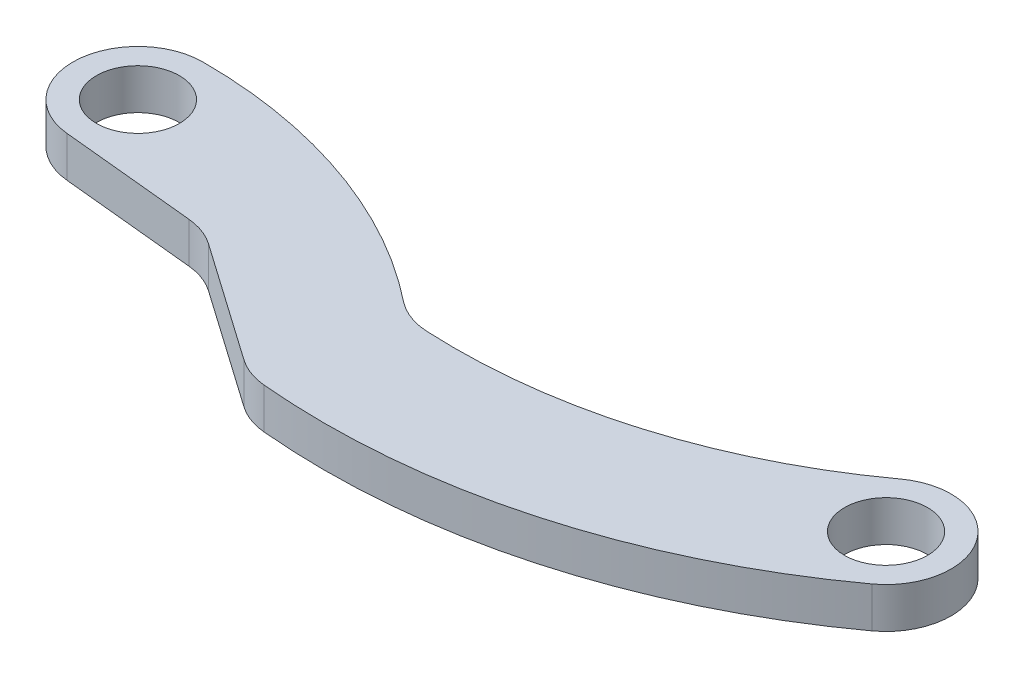
ISO-10303-21;
HEADER;
FILE_DESCRIPTION(('STEP AP214'),'2;1');
FILE_NAME('part.step','',(''),(''),'','','');
FILE_SCHEMA(('AUTOMOTIVE_DESIGN { 1 0 10303 214 1 1 1 1 }'));
ENDSEC;
DATA;
#1=APPLICATION_CONTEXT('core data for automotive mechanical design processes');
#2=APPLICATION_PROTOCOL_DEFINITION('international standard','automotive_design',2000,#1);
#3=PRODUCT_CONTEXT('',#1,'mechanical');
#4=PRODUCT('Part','Part','',(#3));
#5=PRODUCT_RELATED_PRODUCT_CATEGORY('part','',(#4));
#6=PRODUCT_DEFINITION_FORMATION('','',#4);
#7=PRODUCT_DEFINITION_CONTEXT('part definition',#1,'design');
#8=PRODUCT_DEFINITION('design','',#6,#7);
#9=PRODUCT_DEFINITION_SHAPE('','',#8);
#10=(LENGTH_UNIT() NAMED_UNIT(*) SI_UNIT(.MILLI.,.METRE.));
#11=(NAMED_UNIT(*) PLANE_ANGLE_UNIT() SI_UNIT($,.RADIAN.));
#12=(NAMED_UNIT(*) SI_UNIT($,.STERADIAN.) SOLID_ANGLE_UNIT());
#13=UNCERTAINTY_MEASURE_WITH_UNIT(LENGTH_MEASURE(1.E-05),#10,'distance_accuracy_value','');
#14=(GEOMETRIC_REPRESENTATION_CONTEXT(3) GLOBAL_UNCERTAINTY_ASSIGNED_CONTEXT((#13)) GLOBAL_UNIT_ASSIGNED_CONTEXT((#10,
#11,#12)) REPRESENTATION_CONTEXT('',''));
#15=CARTESIAN_POINT('',(0.,0.,0.));
#16=DIRECTION('',(0.,0.,1.));
#17=DIRECTION('',(1.,0.,0.));
#18=AXIS2_PLACEMENT_3D('',#15,#16,#17);
#19=CARTESIAN_POINT('',(0.,5.,0.));
#20=DIRECTION('',(0.,1.,0.));
#21=DIRECTION('',(0.,0.,1.));
#22=AXIS2_PLACEMENT_3D('',#19,#20,#21);
#23=PLANE('',#22);
#24=CARTESIAN_POINT('',(0.,5.,0.));
#25=DIRECTION('',(0.,1.,0.));
#26=DIRECTION('',(0.,0.,1.));
#27=AXIS2_PLACEMENT_3D('',#24,#25,#26);
#28=CIRCLE('',#27,5.1);
#29=CARTESIAN_POINT('',(0.,5.,5.1));
#30=VERTEX_POINT('',#29);
#31=EDGE_CURVE('E212',#30,#30,#28,.T.);
#32=ORIENTED_EDGE('',*,*,#31,.F.);
#33=EDGE_LOOP('',(#32));
#34=FACE_BOUND('',#33,.T.);
#35=DIRECTION('',(0.819152044289021,0.,0.573576436351005));
#36=VECTOR('',#35,1.);
#37=CARTESIAN_POINT('',(17.9822733395991,5.,9.81869503447825));
#38=LINE('',#37,#36);
#39=CARTESIAN_POINT('',(19.6983074450643,5.,11.0202750509498));
#40=VERTEX_POINT('',#39);
#41=CARTESIAN_POINT('',(34.2865390892747,5.,21.2350648173743));
#42=VERTEX_POINT('',#41);
#43=EDGE_CURVE('E126',#40,#42,#38,.T.);
#44=ORIENTED_EDGE('',*,*,#43,.T.);
#45=CARTESIAN_POINT('',(38.8751505800827,5.,14.6818484630621));
#46=DIRECTION('',(0.,1.,0.));
#47=DIRECTION('',(0.,0.,1.));
#48=AXIS2_PLACEMENT_3D('',#45,#46,#47);
#49=CIRCLE('',#48,8.);
#50=CARTESIAN_POINT('',(38.1443967934245,5.,22.6484034841038));
#51=VERTEX_POINT('',#50);
#52=EDGE_CURVE('E171',#42,#51,#49,.T.);
#53=ORIENTED_EDGE('',*,*,#52,.T.);
#54=CARTESIAN_POINT('',(46.,5.,-62.9920629920945));
#55=DIRECTION('',(0.,1.,0.));
#56=DIRECTION('',(0.,0.,-1.));
#57=AXIS2_PLACEMENT_3D('',#54,#55,#56);
#58=CIRCLE('',#57,86.);
#59=CARTESIAN_POINT('',(96.7179487179487,5.,6.46072440944556));
#60=VERTEX_POINT('',#59);
#61=EDGE_CURVE('E196',#51,#60,#58,.T.);
#62=ORIENTED_EDGE('',*,*,#61,.T.);
#63=CARTESIAN_POINT('',(92.,5.,0.));
#64=DIRECTION('',(0.,1.,0.));
#65=DIRECTION('',(0.,0.,1.));
#66=AXIS2_PLACEMENT_3D('',#63,#64,#65);
#67=CIRCLE('',#66,8.00000000000001);
#68=CARTESIAN_POINT('',(87.2820512820513,5.,-6.46072440944559));
#69=VERTEX_POINT('',#68);
#70=EDGE_CURVE('E199',#60,#69,#67,.T.);
#71=ORIENTED_EDGE('',*,*,#70,.T.);
#72=CARTESIAN_POINT('',(46.,5.,-62.9920629920945));
#73=DIRECTION('',(0.,-1.,0.));
#74=DIRECTION('',(0.,0.,1.));
#75=AXIS2_PLACEMENT_3D('',#72,#73,#74);
#76=CIRCLE('',#75,70.);
#77=CARTESIAN_POINT('',(42.4262447468211,5.,6.91665086669692));
#78=VERTEX_POINT('',#77);
#79=EDGE_CURVE('E204',#69,#78,#76,.T.);
#80=ORIENTED_EDGE('',*,*,#79,.T.);
#81=CARTESIAN_POINT('',(42.8346739186129,5.,-1.07291643145068));
#82=DIRECTION('',(0.,1.,0.));
#83=DIRECTION('',(0.,0.,1.));
#84=AXIS2_PLACEMENT_3D('',#81,#82,#83);
#85=CIRCLE('',#84,8.);
#86=CARTESIAN_POINT('',(37.8627584301677,5.,5.19446391250153));
#87=VERTEX_POINT('',#86);
#88=EDGE_CURVE('E179',#78,#87,#85,.F.);
#89=ORIENTED_EDGE('',*,*,#88,.T.);
#90=CARTESIAN_POINT('',(0.,5.,52.9226098362471));
#91=DIRECTION('',(0.,1.,0.));
#92=DIRECTION('',(0.,0.,-1.));
#93=AXIS2_PLACEMENT_3D('',#90,#91,#92);
#94=CIRCLE('',#93,60.9226098362471);
#95=CARTESIAN_POINT('',(0.,5.,-7.99999999999999));
#96=VERTEX_POINT('',#95);
#97=EDGE_CURVE('E132',#87,#96,#94,.T.);
#98=ORIENTED_EDGE('',*,*,#97,.T.);
#99=CARTESIAN_POINT('',(0.,5.,0.));
#100=DIRECTION('',(0.,1.,0.));
#101=DIRECTION('',(0.,0.,1.));
#102=AXIS2_PLACEMENT_3D('',#99,#100,#101);
#103=CIRCLE('',#102,8.);
#104=CARTESIAN_POINT('',(-0.787870548468119,5.,7.96110921912624));
#105=VERTEX_POINT('',#104);
#106=EDGE_CURVE('E127',#96,#105,#103,.T.);
#107=ORIENTED_EDGE('',*,*,#106,.T.);
#108=DIRECTION('',(0.995138652390778,0.,0.0984838185585147));
#109=VECTOR('',#108,1.);
#110=CARTESIAN_POINT('',(-0.787870548468119,5.,7.96110921912624));
#111=LINE('',#110,#109);
#112=CARTESIAN_POINT('',(15.8975665027244,5.,9.61238218613574));
#113=VERTEX_POINT('',#112);
#114=EDGE_CURVE('E117',#105,#113,#111,.T.);
#115=ORIENTED_EDGE('',*,*,#114,.T.);
#116=CARTESIAN_POINT('',(15.1096959542563,5.,17.573491405262));
#117=DIRECTION('',(0.,1.,0.));
#118=DIRECTION('',(0.,0.,1.));
#119=AXIS2_PLACEMENT_3D('',#116,#117,#118);
#120=CIRCLE('',#119,8.);
#121=EDGE_CURVE('E11',#113,#40,#120,.F.);
#122=ORIENTED_EDGE('',*,*,#121,.T.);
#123=EDGE_LOOP('',(#44,#53,#62,#71,#80,#89,#98,#107,#115,#122));
#124=FACE_BOUND('',#123,.T.);
#125=CARTESIAN_POINT('',(92.,5.,0.));
#126=DIRECTION('',(0.,1.,0.));
#127=DIRECTION('',(0.,0.,1.));
#128=AXIS2_PLACEMENT_3D('',#125,#126,#127);
#129=CIRCLE('',#128,5.1);
#130=CARTESIAN_POINT('',(92.,5.,5.1));
#131=VERTEX_POINT('',#130);
#132=EDGE_CURVE('E278',#131,#131,#129,.T.);
#133=ORIENTED_EDGE('',*,*,#132,.F.);
#134=EDGE_LOOP('',(#133));
#135=FACE_BOUND('',#134,.T.);
#136=ADVANCED_FACE('F39',(#34,#124,#135),#23,.T.);
#137=CARTESIAN_POINT('',(0.,0.,0.));
#138=DIRECTION('',(0.,1.,0.));
#139=DIRECTION('',(0.,0.,1.));
#140=AXIS2_PLACEMENT_3D('',#137,#138,#139);
#141=PLANE('',#140);
#142=CARTESIAN_POINT('',(46.,0.,-62.9920629920945));
#143=DIRECTION('',(0.,1.,0.));
#144=DIRECTION('',(0.,0.,-1.));
#145=AXIS2_PLACEMENT_3D('',#142,#143,#144);
#146=CIRCLE('',#145,86.);
#147=CARTESIAN_POINT('',(38.1443967934245,0.,22.6484034841038));
#148=VERTEX_POINT('',#147);
#149=CARTESIAN_POINT('',(96.7179487179487,0.,6.46072440944556));
#150=VERTEX_POINT('',#149);
#151=EDGE_CURVE('E216',#148,#150,#146,.T.);
#152=ORIENTED_EDGE('',*,*,#151,.F.);
#153=CARTESIAN_POINT('',(38.8751505800827,0.,14.6818484630621));
#154=DIRECTION('',(0.,1.,0.));
#155=DIRECTION('',(0.,0.,1.));
#156=AXIS2_PLACEMENT_3D('',#153,#154,#155);
#157=CIRCLE('',#156,8.);
#158=CARTESIAN_POINT('',(34.2865390892747,0.,21.2350648173743));
#159=VERTEX_POINT('',#158);
#160=EDGE_CURVE('E162',#148,#159,#157,.F.);
#161=ORIENTED_EDGE('',*,*,#160,.T.);
#162=DIRECTION('',(0.819152044289021,0.,0.573576436351005));
#163=VECTOR('',#162,1.);
#164=CARTESIAN_POINT('',(17.9822733395991,0.,9.81869503447825));
#165=LINE('',#164,#163);
#166=CARTESIAN_POINT('',(19.6983074450643,0.,11.0202750509498));
#167=VERTEX_POINT('',#166);
#168=EDGE_CURVE('E188',#167,#159,#165,.T.);
#169=ORIENTED_EDGE('',*,*,#168,.F.);
#170=CARTESIAN_POINT('',(15.1096959542563,0.,17.573491405262));
#171=DIRECTION('',(0.,1.,0.));
#172=DIRECTION('',(0.,0.,1.));
#173=AXIS2_PLACEMENT_3D('',#170,#171,#172);
#174=CIRCLE('',#173,8.);
#175=CARTESIAN_POINT('',(15.8975665027244,0.,9.61238218613574));
#176=VERTEX_POINT('',#175);
#177=EDGE_CURVE('E48',#167,#176,#174,.T.);
#178=ORIENTED_EDGE('',*,*,#177,.T.);
#179=DIRECTION('',(0.995138652390778,0.,0.0984838185585147));
#180=VECTOR('',#179,1.);
#181=CARTESIAN_POINT('',(-0.787870548468119,0.,7.96110921912624));
#182=LINE('',#181,#180);
#183=CARTESIAN_POINT('',(-0.787870548468119,0.,7.96110921912624));
#184=VERTEX_POINT('',#183);
#185=EDGE_CURVE('E187',#184,#176,#182,.T.);
#186=ORIENTED_EDGE('',*,*,#185,.F.);
#187=CARTESIAN_POINT('',(0.,0.,0.));
#188=DIRECTION('',(0.,1.,0.));
#189=DIRECTION('',(0.,0.,1.));
#190=AXIS2_PLACEMENT_3D('',#187,#188,#189);
#191=CIRCLE('',#190,8.);
#192=CARTESIAN_POINT('',(0.,0.,-7.99999999999999));
#193=VERTEX_POINT('',#192);
#194=EDGE_CURVE('E141',#193,#184,#191,.T.);
#195=ORIENTED_EDGE('',*,*,#194,.F.);
#196=CARTESIAN_POINT('',(0.,0.,52.9226098362471));
#197=DIRECTION('',(0.,1.,0.));
#198=DIRECTION('',(0.,0.,-1.));
#199=AXIS2_PLACEMENT_3D('',#196,#197,#198);
#200=CIRCLE('',#199,60.9226098362471);
#201=CARTESIAN_POINT('',(37.8627584301677,0.,5.19446391250153));
#202=VERTEX_POINT('',#201);
#203=EDGE_CURVE('E137',#202,#193,#200,.T.);
#204=ORIENTED_EDGE('',*,*,#203,.F.);
#205=CARTESIAN_POINT('',(42.8346739186129,0.,-1.07291643145068));
#206=DIRECTION('',(0.,1.,0.));
#207=DIRECTION('',(0.,0.,1.));
#208=AXIS2_PLACEMENT_3D('',#205,#206,#207);
#209=CIRCLE('',#208,8.);
#210=CARTESIAN_POINT('',(42.4262447468211,0.,6.91665086669692));
#211=VERTEX_POINT('',#210);
#212=EDGE_CURVE('E176',#202,#211,#209,.T.);
#213=ORIENTED_EDGE('',*,*,#212,.T.);
#214=CARTESIAN_POINT('',(46.,0.,-62.9920629920945));
#215=DIRECTION('',(0.,-1.,0.));
#216=DIRECTION('',(0.,0.,1.));
#217=AXIS2_PLACEMENT_3D('',#214,#215,#216);
#218=CIRCLE('',#217,70.);
#219=CARTESIAN_POINT('',(87.2820512820513,0.,-6.46072440944559));
#220=VERTEX_POINT('',#219);
#221=EDGE_CURVE('E222',#220,#211,#218,.T.);
#222=ORIENTED_EDGE('',*,*,#221,.F.);
#223=CARTESIAN_POINT('',(92.,0.,0.));
#224=DIRECTION('',(0.,1.,0.));
#225=DIRECTION('',(0.,0.,1.));
#226=AXIS2_PLACEMENT_3D('',#223,#224,#225);
#227=CIRCLE('',#226,8.00000000000001);
#228=EDGE_CURVE('E219',#150,#220,#227,.T.);
#229=ORIENTED_EDGE('',*,*,#228,.F.);
#230=EDGE_LOOP('',(#152,#161,#169,#178,#186,#195,#204,#213,#222,#229));
#231=FACE_BOUND('',#230,.T.);
#232=CARTESIAN_POINT('',(0.,0.,0.));
#233=DIRECTION('',(0.,1.,0.));
#234=DIRECTION('',(0.,0.,1.));
#235=AXIS2_PLACEMENT_3D('',#232,#233,#234);
#236=CIRCLE('',#235,5.1);
#237=CARTESIAN_POINT('',(0.,0.,5.1));
#238=VERTEX_POINT('',#237);
#239=EDGE_CURVE('E286',#238,#238,#236,.T.);
#240=ORIENTED_EDGE('',*,*,#239,.T.);
#241=EDGE_LOOP('',(#240));
#242=FACE_BOUND('',#241,.T.);
#243=CARTESIAN_POINT('',(92.,0.,0.));
#244=DIRECTION('',(0.,1.,0.));
#245=DIRECTION('',(0.,0.,1.));
#246=AXIS2_PLACEMENT_3D('',#243,#244,#245);
#247=CIRCLE('',#246,5.1);
#248=CARTESIAN_POINT('',(92.,0.,5.1));
#249=VERTEX_POINT('',#248);
#250=EDGE_CURVE('E281',#249,#249,#247,.T.);
#251=ORIENTED_EDGE('',*,*,#250,.T.);
#252=EDGE_LOOP('',(#251));
#253=FACE_BOUND('',#252,.T.);
#254=ADVANCED_FACE('F185',(#231,#242,#253),#141,.F.);
#255=CARTESIAN_POINT('',(0.,5.,0.));
#256=DIRECTION('',(0.,-1.,0.));
#257=DIRECTION('',(0.,0.,-1.));
#258=AXIS2_PLACEMENT_3D('',#255,#256,#257);
#259=CYLINDRICAL_SURFACE('',#258,8.);
#260=ORIENTED_EDGE('',*,*,#194,.T.);
#261=DIRECTION('',(0.,-1.,0.));
#262=VECTOR('',#261,1.);
#263=CARTESIAN_POINT('',(-0.787870548468119,5.,7.96110921912624));
#264=LINE('',#263,#262);
#265=EDGE_CURVE('E121',#105,#184,#264,.T.);
#266=ORIENTED_EDGE('',*,*,#265,.F.);
#267=ORIENTED_EDGE('',*,*,#106,.F.);
#268=DIRECTION('',(0.,-1.,0.));
#269=VECTOR('',#268,1.);
#270=CARTESIAN_POINT('',(0.,5.,-7.99999999999999));
#271=LINE('',#270,#269);
#272=EDGE_CURVE('E210',#96,#193,#271,.T.);
#273=ORIENTED_EDGE('',*,*,#272,.T.);
#274=EDGE_LOOP('',(#260,#266,#267,#273));
#275=FACE_BOUND('',#274,.T.);
#276=ADVANCED_FACE('F139',(#275),#259,.T.);
#277=CARTESIAN_POINT('',(-0.787870548468119,5.,7.96110921912624));
#278=DIRECTION('',(0.0984838185585147,0.,-0.995138652390778));
#279=DIRECTION('',(-0.995138652390778,0.,-0.0984838185585147));
#280=AXIS2_PLACEMENT_3D('',#277,#278,#279);
#281=PLANE('',#280);
#282=ORIENTED_EDGE('',*,*,#185,.T.);
#283=DIRECTION('',(0.,-1.,0.));
#284=VECTOR('',#283,1.);
#285=CARTESIAN_POINT('',(15.8975665027244,5.,9.61238218613574));
#286=LINE('',#285,#284);
#287=EDGE_CURVE('E55',#176,#113,#286,.F.);
#288=ORIENTED_EDGE('',*,*,#287,.T.);
#289=ORIENTED_EDGE('',*,*,#114,.F.);
#290=ORIENTED_EDGE('',*,*,#265,.T.);
#291=EDGE_LOOP('',(#282,#288,#289,#290));
#292=FACE_BOUND('',#291,.T.);
#293=ADVANCED_FACE('F119',(#292),#281,.F.);
#294=CARTESIAN_POINT('',(17.9822733395991,5.,9.81869503447825));
#295=DIRECTION('',(0.573576436351005,0.,-0.819152044289021));
#296=DIRECTION('',(-0.819152044289021,0.,-0.573576436351005));
#297=AXIS2_PLACEMENT_3D('',#294,#295,#296);
#298=PLANE('',#297);
#299=ORIENTED_EDGE('',*,*,#168,.T.);
#300=DIRECTION('',(0.,-1.,0.));
#301=VECTOR('',#300,1.);
#302=CARTESIAN_POINT('',(34.2865390892747,5.,21.2350648173743));
#303=LINE('',#302,#301);
#304=EDGE_CURVE('E63',#159,#42,#303,.F.);
#305=ORIENTED_EDGE('',*,*,#304,.T.);
#306=ORIENTED_EDGE('',*,*,#43,.F.);
#307=DIRECTION('',(0.,-1.,0.));
#308=VECTOR('',#307,1.);
#309=CARTESIAN_POINT('',(19.6983074450643,0.,11.0202750509498));
#310=LINE('',#309,#308);
#311=EDGE_CURVE('E165',#40,#167,#310,.T.);
#312=ORIENTED_EDGE('',*,*,#311,.T.);
#313=EDGE_LOOP('',(#299,#305,#306,#312));
#314=FACE_BOUND('',#313,.T.);
#315=ADVANCED_FACE('F194',(#314),#298,.F.);
#316=CARTESIAN_POINT('',(46.,5.,-62.9920629920945));
#317=DIRECTION('',(0.,-1.,0.));
#318=DIRECTION('',(0.,0.,-1.));
#319=AXIS2_PLACEMENT_3D('',#316,#317,#318);
#320=CYLINDRICAL_SURFACE('',#319,86.);
#321=ORIENTED_EDGE('',*,*,#61,.F.);
#322=DIRECTION('',(0.,-1.,0.));
#323=VECTOR('',#322,1.);
#324=CARTESIAN_POINT('',(38.1443967934245,5.,22.6484034841038));
#325=LINE('',#324,#323);
#326=EDGE_CURVE('E158',#51,#148,#325,.T.);
#327=ORIENTED_EDGE('',*,*,#326,.T.);
#328=ORIENTED_EDGE('',*,*,#151,.T.);
#329=DIRECTION('',(0.,-1.,0.));
#330=VECTOR('',#329,1.);
#331=CARTESIAN_POINT('',(96.7179487179487,5.,6.46072440944556));
#332=LINE('',#331,#330);
#333=EDGE_CURVE('E144',#60,#150,#332,.T.);
#334=ORIENTED_EDGE('',*,*,#333,.F.);
#335=EDGE_LOOP('',(#321,#327,#328,#334));
#336=FACE_BOUND('',#335,.T.);
#337=ADVANCED_FACE('F307',(#336),#320,.T.);
#338=CARTESIAN_POINT('',(92.,5.,0.));
#339=DIRECTION('',(0.,-1.,0.));
#340=DIRECTION('',(0.,0.,-1.));
#341=AXIS2_PLACEMENT_3D('',#338,#339,#340);
#342=CYLINDRICAL_SURFACE('',#341,8.00000000000001);
#343=ORIENTED_EDGE('',*,*,#228,.T.);
#344=DIRECTION('',(0.,-1.,0.));
#345=VECTOR('',#344,1.);
#346=CARTESIAN_POINT('',(87.2820512820513,5.,-6.46072440944559));
#347=LINE('',#346,#345);
#348=EDGE_CURVE('E152',#69,#220,#347,.T.);
#349=ORIENTED_EDGE('',*,*,#348,.F.);
#350=ORIENTED_EDGE('',*,*,#70,.F.);
#351=ORIENTED_EDGE('',*,*,#333,.T.);
#352=EDGE_LOOP('',(#343,#349,#350,#351));
#353=FACE_BOUND('',#352,.T.);
#354=ADVANCED_FACE('F257',(#353),#342,.T.);
#355=CARTESIAN_POINT('',(46.,5.,-62.9920629920945));
#356=DIRECTION('',(0.,-1.,0.));
#357=DIRECTION('',(0.,0.,-1.));
#358=AXIS2_PLACEMENT_3D('',#355,#356,#357);
#359=CYLINDRICAL_SURFACE('',#358,70.);
#360=ORIENTED_EDGE('',*,*,#221,.T.);
#361=DIRECTION('',(0.,-1.,0.));
#362=VECTOR('',#361,1.);
#363=CARTESIAN_POINT('',(42.4262447468211,5.,6.91665086669693));
#364=LINE('',#363,#362);
#365=EDGE_CURVE('E149',#211,#78,#364,.F.);
#366=ORIENTED_EDGE('',*,*,#365,.T.);
#367=ORIENTED_EDGE('',*,*,#79,.F.);
#368=ORIENTED_EDGE('',*,*,#348,.T.);
#369=EDGE_LOOP('',(#360,#366,#367,#368));
#370=FACE_BOUND('',#369,.T.);
#371=ADVANCED_FACE('F235',(#370),#359,.F.);
#372=CARTESIAN_POINT('',(0.,5.,52.9226098362471));
#373=DIRECTION('',(0.,-1.,0.));
#374=DIRECTION('',(0.,0.,-1.));
#375=AXIS2_PLACEMENT_3D('',#372,#373,#374);
#376=CYLINDRICAL_SURFACE('',#375,60.9226098362471);
#377=ORIENTED_EDGE('',*,*,#97,.F.);
#378=DIRECTION('',(0.,-1.,0.));
#379=VECTOR('',#378,1.);
#380=CARTESIAN_POINT('',(37.8627584301677,5.,5.19446391250152));
#381=LINE('',#380,#379);
#382=EDGE_CURVE('E143',#87,#202,#381,.T.);
#383=ORIENTED_EDGE('',*,*,#382,.T.);
#384=ORIENTED_EDGE('',*,*,#203,.T.);
#385=ORIENTED_EDGE('',*,*,#272,.F.);
#386=EDGE_LOOP('',(#377,#383,#384,#385));
#387=FACE_BOUND('',#386,.T.);
#388=ADVANCED_FACE('F246',(#387),#376,.T.);
#389=CARTESIAN_POINT('',(0.,5.,0.));
#390=DIRECTION('',(0.,-1.,0.));
#391=DIRECTION('',(0.,0.,-1.));
#392=AXIS2_PLACEMENT_3D('',#389,#390,#391);
#393=CYLINDRICAL_SURFACE('',#392,5.1);
#394=ORIENTED_EDGE('',*,*,#31,.T.);
#395=EDGE_LOOP('',(#394));
#396=FACE_BOUND('',#395,.T.);
#397=ORIENTED_EDGE('',*,*,#239,.F.);
#398=EDGE_LOOP('',(#397));
#399=FACE_BOUND('',#398,.T.);
#400=ADVANCED_FACE('F248',(#396,#399),#393,.F.);
#401=CARTESIAN_POINT('',(92.,5.,0.));
#402=DIRECTION('',(0.,-1.,0.));
#403=DIRECTION('',(0.,0.,-1.));
#404=AXIS2_PLACEMENT_3D('',#401,#402,#403);
#405=CYLINDRICAL_SURFACE('',#404,5.1);
#406=ORIENTED_EDGE('',*,*,#132,.T.);
#407=EDGE_LOOP('',(#406));
#408=FACE_BOUND('',#407,.T.);
#409=ORIENTED_EDGE('',*,*,#250,.F.);
#410=EDGE_LOOP('',(#409));
#411=FACE_BOUND('',#410,.T.);
#412=ADVANCED_FACE('F254',(#408,#411),#405,.F.);
#413=CARTESIAN_POINT('',(42.8346739186129,5.,-1.07291643145068));
#414=DIRECTION('',(0.,-1.,0.));
#415=DIRECTION('',(0.,0.,-1.));
#416=AXIS2_PLACEMENT_3D('',#413,#414,#415);
#417=CYLINDRICAL_SURFACE('',#416,8.);
#418=ORIENTED_EDGE('',*,*,#88,.F.);
#419=ORIENTED_EDGE('',*,*,#365,.F.);
#420=ORIENTED_EDGE('',*,*,#212,.F.);
#421=ORIENTED_EDGE('',*,*,#382,.F.);
#422=EDGE_LOOP('',(#418,#419,#420,#421));
#423=FACE_BOUND('',#422,.T.);
#424=ADVANCED_FACE('F244',(#423),#417,.F.);
#425=CARTESIAN_POINT('',(38.8751505800827,5.,14.6818484630621));
#426=DIRECTION('',(0.,-1.,0.));
#427=DIRECTION('',(0.,0.,-1.));
#428=AXIS2_PLACEMENT_3D('',#425,#426,#427);
#429=CYLINDRICAL_SURFACE('',#428,8.);
#430=ORIENTED_EDGE('',*,*,#52,.F.);
#431=ORIENTED_EDGE('',*,*,#304,.F.);
#432=ORIENTED_EDGE('',*,*,#160,.F.);
#433=ORIENTED_EDGE('',*,*,#326,.F.);
#434=EDGE_LOOP('',(#430,#431,#432,#433));
#435=FACE_BOUND('',#434,.T.);
#436=ADVANCED_FACE('F273',(#435),#429,.T.);
#437=CARTESIAN_POINT('',(15.1096959542563,5.,17.573491405262));
#438=DIRECTION('',(0.,1.,0.));
#439=DIRECTION('',(0.,0.,1.));
#440=AXIS2_PLACEMENT_3D('',#437,#438,#439);
#441=CYLINDRICAL_SURFACE('',#440,8.);
#442=ORIENTED_EDGE('',*,*,#121,.F.);
#443=ORIENTED_EDGE('',*,*,#287,.F.);
#444=ORIENTED_EDGE('',*,*,#177,.F.);
#445=ORIENTED_EDGE('',*,*,#311,.F.);
#446=EDGE_LOOP('',(#442,#443,#444,#445));
#447=FACE_BOUND('',#446,.T.);
#448=ADVANCED_FACE('F41',(#447),#441,.F.);
#449=CLOSED_SHELL('',(#136,#254,#276,#293,#315,#337,#354,#371,#388,#400,#412,#424,#436,#448));
#450=MANIFOLD_SOLID_BREP('B2',#449);
#451=ADVANCED_BREP_SHAPE_REPRESENTATION('',(#18,#450),#14);
#452=SHAPE_DEFINITION_REPRESENTATION(#9,#451);
ENDSEC;
END-ISO-10303-21;
